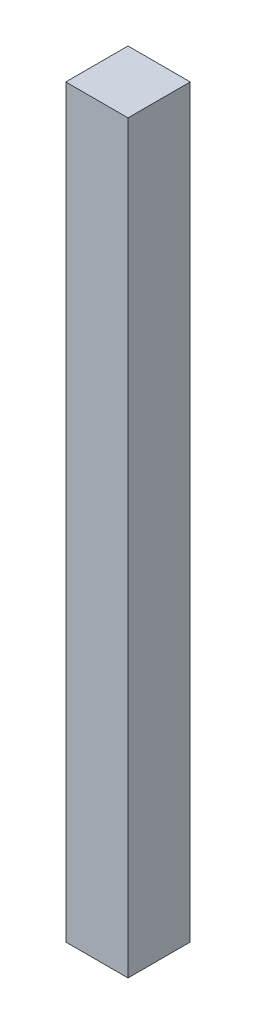
ISO-10303-21;
HEADER;
FILE_DESCRIPTION(('STEP AP214'),'2;1');
FILE_NAME('part.step','',(''),(''),'','','');
FILE_SCHEMA(('AUTOMOTIVE_DESIGN { 1 0 10303 214 1 1 1 1 }'));
ENDSEC;
DATA;
#1=APPLICATION_CONTEXT('core data for automotive mechanical design processes');
#2=APPLICATION_PROTOCOL_DEFINITION('international standard','automotive_design',2000,#1);
#3=PRODUCT_CONTEXT('',#1,'mechanical');
#4=PRODUCT('Part','Part','',(#3));
#5=PRODUCT_RELATED_PRODUCT_CATEGORY('part','',(#4));
#6=PRODUCT_DEFINITION_FORMATION('','',#4);
#7=PRODUCT_DEFINITION_CONTEXT('part definition',#1,'design');
#8=PRODUCT_DEFINITION('design','',#6,#7);
#9=PRODUCT_DEFINITION_SHAPE('','',#8);
#10=(LENGTH_UNIT() NAMED_UNIT(*) SI_UNIT(.MILLI.,.METRE.));
#11=(NAMED_UNIT(*) PLANE_ANGLE_UNIT() SI_UNIT($,.RADIAN.));
#12=(NAMED_UNIT(*) SI_UNIT($,.STERADIAN.) SOLID_ANGLE_UNIT());
#13=UNCERTAINTY_MEASURE_WITH_UNIT(LENGTH_MEASURE(1.E-05),#10,'distance_accuracy_value','');
#14=(GEOMETRIC_REPRESENTATION_CONTEXT(3) GLOBAL_UNCERTAINTY_ASSIGNED_CONTEXT((#13)) GLOBAL_UNIT_ASSIGNED_CONTEXT((#10,
#11,#12)) REPRESENTATION_CONTEXT('',''));
#15=CARTESIAN_POINT('',(0.,0.,0.));
#16=DIRECTION('',(0.,0.,1.));
#17=DIRECTION('',(1.,0.,0.));
#18=AXIS2_PLACEMENT_3D('',#15,#16,#17);
#19=CARTESIAN_POINT('',(25.4,608.0125,25.4));
#20=DIRECTION('',(-1.,0.,0.));
#21=DIRECTION('',(0.,0.,1.));
#22=AXIS2_PLACEMENT_3D('',#19,#20,#21);
#23=PLANE('',#22);
#24=DIRECTION('',(0.,0.,-1.));
#25=VECTOR('',#24,1.);
#26=CARTESIAN_POINT('',(25.4,0.,25.4));
#27=LINE('',#26,#25);
#28=CARTESIAN_POINT('',(25.4,0.,25.4));
#29=VERTEX_POINT('',#28);
#30=CARTESIAN_POINT('',(25.4,0.,-25.4));
#31=VERTEX_POINT('',#30);
#32=EDGE_CURVE('E111',#29,#31,#27,.T.);
#33=ORIENTED_EDGE('',*,*,#32,.T.);
#34=DIRECTION('',(0.,-1.,0.));
#35=VECTOR('',#34,1.);
#36=CARTESIAN_POINT('',(25.4,608.0125,-25.4));
#37=LINE('',#36,#35);
#38=CARTESIAN_POINT('',(25.4,608.0125,-25.4));
#39=VERTEX_POINT('',#38);
#40=EDGE_CURVE('E11',#39,#31,#37,.T.);
#41=ORIENTED_EDGE('',*,*,#40,.F.);
#42=DIRECTION('',(0.,0.,-1.));
#43=VECTOR('',#42,1.);
#44=CARTESIAN_POINT('',(25.4,608.0125,25.4));
#45=LINE('',#44,#43);
#46=CARTESIAN_POINT('',(25.4,608.0125,25.4));
#47=VERTEX_POINT('',#46);
#48=EDGE_CURVE('E95',#47,#39,#45,.T.);
#49=ORIENTED_EDGE('',*,*,#48,.F.);
#50=DIRECTION('',(0.,-1.,0.));
#51=VECTOR('',#50,1.);
#52=CARTESIAN_POINT('',(25.4,608.0125,25.4));
#53=LINE('',#52,#51);
#54=EDGE_CURVE('E107',#47,#29,#53,.T.);
#55=ORIENTED_EDGE('',*,*,#54,.T.);
#56=EDGE_LOOP('',(#33,#41,#49,#55));
#57=FACE_BOUND('',#56,.T.);
#58=ADVANCED_FACE('F43',(#57),#23,.F.);
#59=CARTESIAN_POINT('',(-25.4,608.0125,-25.4));
#60=DIRECTION('',(0.,0.,1.));
#61=DIRECTION('',(1.,0.,0.));
#62=AXIS2_PLACEMENT_3D('',#59,#60,#61);
#63=PLANE('',#62);
#64=DIRECTION('',(-1.,0.,0.));
#65=VECTOR('',#64,1.);
#66=CARTESIAN_POINT('',(-25.4,0.,-25.4));
#67=LINE('',#66,#65);
#68=CARTESIAN_POINT('',(-25.4,0.,-25.4));
#69=VERTEX_POINT('',#68);
#70=EDGE_CURVE('E100',#31,#69,#67,.T.);
#71=ORIENTED_EDGE('',*,*,#70,.T.);
#72=DIRECTION('',(0.,-1.,0.));
#73=VECTOR('',#72,1.);
#74=CARTESIAN_POINT('',(-25.4,608.0125,-25.4));
#75=LINE('',#74,#73);
#76=CARTESIAN_POINT('',(-25.4,608.0125,-25.4));
#77=VERTEX_POINT('',#76);
#78=EDGE_CURVE('E52',#77,#69,#75,.T.);
#79=ORIENTED_EDGE('',*,*,#78,.F.);
#80=DIRECTION('',(-1.,0.,0.));
#81=VECTOR('',#80,1.);
#82=CARTESIAN_POINT('',(-25.4,608.0125,-25.4));
#83=LINE('',#82,#81);
#84=EDGE_CURVE('E90',#39,#77,#83,.T.);
#85=ORIENTED_EDGE('',*,*,#84,.F.);
#86=ORIENTED_EDGE('',*,*,#40,.T.);
#87=EDGE_LOOP('',(#71,#79,#85,#86));
#88=FACE_BOUND('',#87,.T.);
#89=ADVANCED_FACE('F99',(#88),#63,.F.);
#90=CARTESIAN_POINT('',(-25.4,608.0125,25.4));
#91=DIRECTION('',(1.,0.,0.));
#92=DIRECTION('',(0.,0.,-1.));
#93=AXIS2_PLACEMENT_3D('',#90,#91,#92);
#94=PLANE('',#93);
#95=DIRECTION('',(0.,0.,1.));
#96=VECTOR('',#95,1.);
#97=CARTESIAN_POINT('',(-25.4,0.,25.4));
#98=LINE('',#97,#96);
#99=CARTESIAN_POINT('',(-25.4,0.,25.4));
#100=VERTEX_POINT('',#99);
#101=EDGE_CURVE('E77',#69,#100,#98,.T.);
#102=ORIENTED_EDGE('',*,*,#101,.T.);
#103=DIRECTION('',(0.,-1.,0.));
#104=VECTOR('',#103,1.);
#105=CARTESIAN_POINT('',(-25.4,608.0125,25.4));
#106=LINE('',#105,#104);
#107=CARTESIAN_POINT('',(-25.4,608.0125,25.4));
#108=VERTEX_POINT('',#107);
#109=EDGE_CURVE('E102',#108,#100,#106,.T.);
#110=ORIENTED_EDGE('',*,*,#109,.F.);
#111=DIRECTION('',(0.,0.,1.));
#112=VECTOR('',#111,1.);
#113=CARTESIAN_POINT('',(-25.4,608.0125,25.4));
#114=LINE('',#113,#112);
#115=EDGE_CURVE('E93',#77,#108,#114,.T.);
#116=ORIENTED_EDGE('',*,*,#115,.F.);
#117=ORIENTED_EDGE('',*,*,#78,.T.);
#118=EDGE_LOOP('',(#102,#110,#116,#117));
#119=FACE_BOUND('',#118,.T.);
#120=ADVANCED_FACE('F103',(#119),#94,.F.);
#121=CARTESIAN_POINT('',(-25.4,608.0125,25.4));
#122=DIRECTION('',(0.,0.,-1.));
#123=DIRECTION('',(-1.,0.,0.));
#124=AXIS2_PLACEMENT_3D('',#121,#122,#123);
#125=PLANE('',#124);
#126=DIRECTION('',(1.,0.,0.));
#127=VECTOR('',#126,1.);
#128=CARTESIAN_POINT('',(-25.4,0.,25.4));
#129=LINE('',#128,#127);
#130=EDGE_CURVE('E83',#100,#29,#129,.T.);
#131=ORIENTED_EDGE('',*,*,#130,.T.);
#132=ORIENTED_EDGE('',*,*,#54,.F.);
#133=DIRECTION('',(1.,0.,0.));
#134=VECTOR('',#133,1.);
#135=CARTESIAN_POINT('',(-25.4,608.0125,25.4));
#136=LINE('',#135,#134);
#137=EDGE_CURVE('E60',#108,#47,#136,.T.);
#138=ORIENTED_EDGE('',*,*,#137,.F.);
#139=ORIENTED_EDGE('',*,*,#109,.T.);
#140=EDGE_LOOP('',(#131,#132,#138,#139));
#141=FACE_BOUND('',#140,.T.);
#142=ADVANCED_FACE('F124',(#141),#125,.F.);
#143=CARTESIAN_POINT('',(0.,608.0125,0.));
#144=DIRECTION('',(0.,-1.,0.));
#145=DIRECTION('',(0.,0.,-1.));
#146=AXIS2_PLACEMENT_3D('',#143,#144,#145);
#147=PLANE('',#146);
#148=ORIENTED_EDGE('',*,*,#48,.T.);
#149=ORIENTED_EDGE('',*,*,#84,.T.);
#150=ORIENTED_EDGE('',*,*,#115,.T.);
#151=ORIENTED_EDGE('',*,*,#137,.T.);
#152=EDGE_LOOP('',(#148,#149,#150,#151));
#153=FACE_BOUND('',#152,.T.);
#154=ADVANCED_FACE('F91',(#153),#147,.F.);
#155=CARTESIAN_POINT('',(0.,0.,0.));
#156=DIRECTION('',(0.,-1.,0.));
#157=DIRECTION('',(0.,0.,-1.));
#158=AXIS2_PLACEMENT_3D('',#155,#156,#157);
#159=PLANE('',#158);
#160=ORIENTED_EDGE('',*,*,#32,.F.);
#161=ORIENTED_EDGE('',*,*,#130,.F.);
#162=ORIENTED_EDGE('',*,*,#101,.F.);
#163=ORIENTED_EDGE('',*,*,#70,.F.);
#164=EDGE_LOOP('',(#160,#161,#162,#163));
#165=FACE_BOUND('',#164,.T.);
#166=ADVANCED_FACE('F127',(#165),#159,.T.);
#167=CLOSED_SHELL('',(#58,#89,#120,#142,#154,#166));
#168=MANIFOLD_SOLID_BREP('B2',#167);
#169=ADVANCED_BREP_SHAPE_REPRESENTATION('',(#18,#168),#14);
#170=SHAPE_DEFINITION_REPRESENTATION(#9,#169);
ENDSEC;
END-ISO-10303-21;
